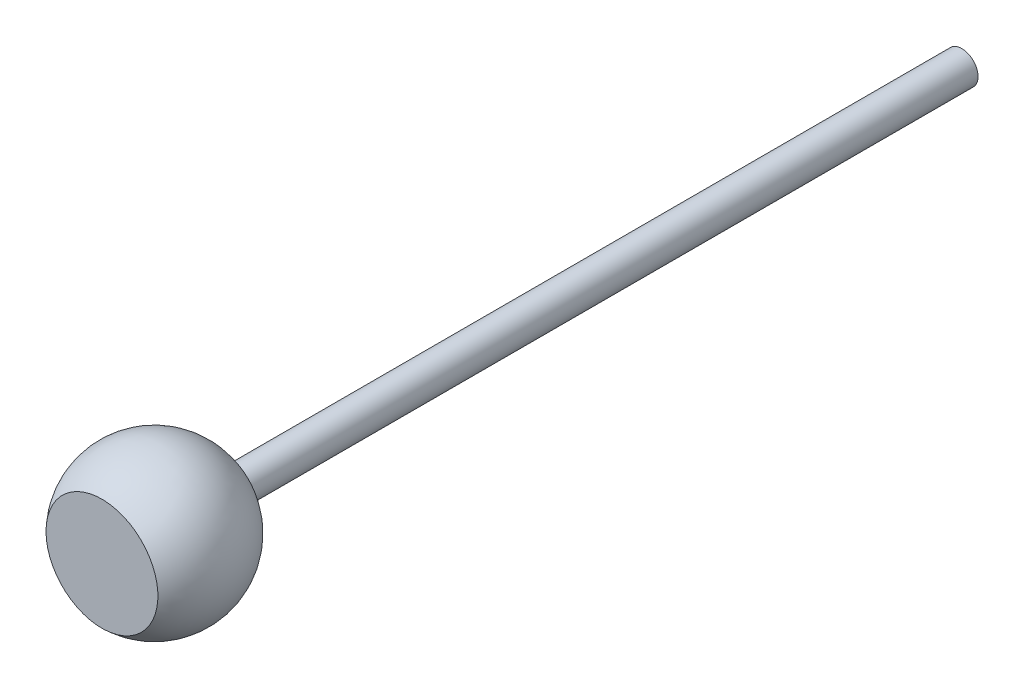
ISO-10303-21;
HEADER;
FILE_DESCRIPTION(('STEP AP214'),'2;1');
FILE_NAME('part.step','',(''),(''),'','','');
FILE_SCHEMA(('AUTOMOTIVE_DESIGN { 1 0 10303 214 1 1 1 1 }'));
ENDSEC;
DATA;
#1=APPLICATION_CONTEXT('core data for automotive mechanical design processes');
#2=APPLICATION_PROTOCOL_DEFINITION('international standard','automotive_design',2000,#1);
#3=PRODUCT_CONTEXT('',#1,'mechanical');
#4=PRODUCT('Part','Part','',(#3));
#5=PRODUCT_RELATED_PRODUCT_CATEGORY('part','',(#4));
#6=PRODUCT_DEFINITION_FORMATION('','',#4);
#7=PRODUCT_DEFINITION_CONTEXT('part definition',#1,'design');
#8=PRODUCT_DEFINITION('design','',#6,#7);
#9=PRODUCT_DEFINITION_SHAPE('','',#8);
#10=(LENGTH_UNIT() NAMED_UNIT(*) SI_UNIT(.MILLI.,.METRE.));
#11=(NAMED_UNIT(*) PLANE_ANGLE_UNIT() SI_UNIT($,.RADIAN.));
#12=(NAMED_UNIT(*) SI_UNIT($,.STERADIAN.) SOLID_ANGLE_UNIT());
#13=UNCERTAINTY_MEASURE_WITH_UNIT(LENGTH_MEASURE(1.E-05),#10,'distance_accuracy_value','');
#14=(GEOMETRIC_REPRESENTATION_CONTEXT(3) GLOBAL_UNCERTAINTY_ASSIGNED_CONTEXT((#13)) GLOBAL_UNIT_ASSIGNED_CONTEXT((#10,
#11,#12)) REPRESENTATION_CONTEXT('',''));
#15=CARTESIAN_POINT('',(0.,0.,0.));
#16=DIRECTION('',(0.,0.,1.));
#17=DIRECTION('',(1.,0.,0.));
#18=AXIS2_PLACEMENT_3D('',#15,#16,#17);
#19=CARTESIAN_POINT('',(0.,0.,40.));
#20=DIRECTION('',(0.,0.,-1.));
#21=DIRECTION('',(-1.,0.,0.));
#22=AXIS2_PLACEMENT_3D('',#19,#20,#21);
#23=CYLINDRICAL_SURFACE('',#22,2.);
#24=CARTESIAN_POINT('',(0.,0.,30.7129121894966));
#25=DIRECTION('',(0.,0.,1.));
#26=DIRECTION('',(1.,0.,0.));
#27=AXIS2_PLACEMENT_3D('',#24,#25,#26);
#28=CIRCLE('',#27,2.);
#29=CARTESIAN_POINT('',(2.,0.,30.7129121894966));
#30=VERTEX_POINT('',#29);
#31=EDGE_CURVE('E10',#30,#30,#28,.T.);
#32=ORIENTED_EDGE('',*,*,#31,.F.);
#33=EDGE_LOOP('',(#32));
#34=FACE_BOUND('',#33,.T.);
#35=CARTESIAN_POINT('',(0.,0.,-60.));
#36=DIRECTION('',(0.,0.,-1.));
#37=DIRECTION('',(-1.,0.,0.));
#38=AXIS2_PLACEMENT_3D('',#35,#36,#37);
#39=CIRCLE('',#38,2.);
#40=CARTESIAN_POINT('',(-2.,0.,-60.));
#41=VERTEX_POINT('',#40);
#42=EDGE_CURVE('E38',#41,#41,#39,.T.);
#43=ORIENTED_EDGE('',*,*,#42,.F.);
#44=EDGE_LOOP('',(#43));
#45=FACE_BOUND('',#44,.T.);
#46=ADVANCED_FACE('F31',(#34,#45),#23,.T.);
#47=CARTESIAN_POINT('',(0.,0.,40.));
#48=DIRECTION('',(-1.,0.,0.));
#49=DIRECTION('',(0.,0.,-1.));
#50=AXIS2_PLACEMENT_3D('',#47,#48,#49);
#51=SPHERICAL_SURFACE('',#50,9.5);
#52=CARTESIAN_POINT('',(0.,0.,40.));
#53=DIRECTION('',(0.,0.,-1.));
#54=DIRECTION('',(-1.,0.,0.));
#55=AXIS2_PLACEMENT_3D('',#52,#53,#54);
#56=SPHERICAL_SURFACE('',#55,9.5);
#57=CARTESIAN_POINT('',(0.,0.,46.5));
#58=DIRECTION('',(0.,0.,-1.));
#59=DIRECTION('',(-1.,0.,0.));
#60=AXIS2_PLACEMENT_3D('',#57,#58,#59);
#61=CIRCLE('',#60,6.92820323027551);
#62=CARTESIAN_POINT('',(-6.92820323027551,0.,46.5));
#63=VERTEX_POINT('',#62);
#64=EDGE_CURVE('E34',#63,#63,#61,.T.);
#65=ORIENTED_EDGE('',*,*,#64,.T.);
#66=EDGE_LOOP('',(#65));
#67=FACE_BOUND('',#66,.T.);
#68=ORIENTED_EDGE('',*,*,#31,.T.);
#69=EDGE_LOOP('',(#68));
#70=FACE_BOUND('',#69,.T.);
#71=ADVANCED_FACE('F48',(#67,#70),#56,.T.);
#72=CARTESIAN_POINT('',(0.,0.,-60.));
#73=DIRECTION('',(0.,0.,-1.));
#74=DIRECTION('',(-1.,0.,0.));
#75=AXIS2_PLACEMENT_3D('',#72,#73,#74);
#76=PLANE('',#75);
#77=ORIENTED_EDGE('',*,*,#42,.T.);
#78=EDGE_LOOP('',(#77));
#79=FACE_BOUND('',#78,.T.);
#80=ADVANCED_FACE('F52',(#79),#76,.T.);
#81=CARTESIAN_POINT('',(-9.5,0.,46.5));
#82=DIRECTION('',(0.,0.,-1.));
#83=DIRECTION('',(-1.,0.,0.));
#84=AXIS2_PLACEMENT_3D('',#81,#82,#83);
#85=PLANE('',#84);
#86=ORIENTED_EDGE('',*,*,#64,.F.);
#87=EDGE_LOOP('',(#86));
#88=FACE_BOUND('',#87,.T.);
#89=ADVANCED_FACE('F50',(#88),#85,.F.);
#90=CLOSED_SHELL('',(#46,#71,#80,#89));
#91=MANIFOLD_SOLID_BREP('B2',#90);
#92=ADVANCED_BREP_SHAPE_REPRESENTATION('',(#18,#91),#14);
#93=SHAPE_DEFINITION_REPRESENTATION(#9,#92);
ENDSEC;
END-ISO-10303-21;
